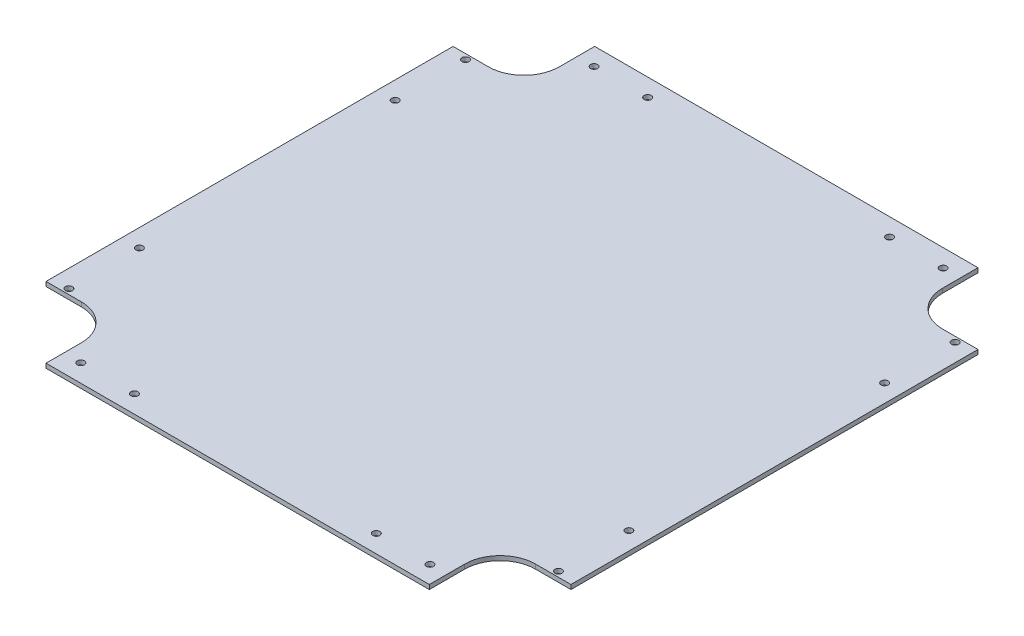
ISO-10303-21;
HEADER;
FILE_DESCRIPTION(('STEP AP214'),'2;1');
FILE_NAME('part.step','',(''),(''),'','','');
FILE_SCHEMA(('AUTOMOTIVE_DESIGN { 1 0 10303 214 1 1 1 1 }'));
ENDSEC;
DATA;
#1=APPLICATION_CONTEXT('core data for automotive mechanical design processes');
#2=APPLICATION_PROTOCOL_DEFINITION('international standard','automotive_design',2000,#1);
#3=PRODUCT_CONTEXT('',#1,'mechanical');
#4=PRODUCT('Part','Part','',(#3));
#5=PRODUCT_RELATED_PRODUCT_CATEGORY('part','',(#4));
#6=PRODUCT_DEFINITION_FORMATION('','',#4);
#7=PRODUCT_DEFINITION_CONTEXT('part definition',#1,'design');
#8=PRODUCT_DEFINITION('design','',#6,#7);
#9=PRODUCT_DEFINITION_SHAPE('','',#8);
#10=(LENGTH_UNIT() NAMED_UNIT(*) SI_UNIT(.MILLI.,.METRE.));
#11=(NAMED_UNIT(*) PLANE_ANGLE_UNIT() SI_UNIT($,.RADIAN.));
#12=(NAMED_UNIT(*) SI_UNIT($,.STERADIAN.) SOLID_ANGLE_UNIT());
#13=UNCERTAINTY_MEASURE_WITH_UNIT(LENGTH_MEASURE(1.E-05),#10,'distance_accuracy_value','');
#14=(GEOMETRIC_REPRESENTATION_CONTEXT(3) GLOBAL_UNCERTAINTY_ASSIGNED_CONTEXT((#13)) GLOBAL_UNIT_ASSIGNED_CONTEXT((#10,
#11,#12)) REPRESENTATION_CONTEXT('',''));
#15=CARTESIAN_POINT('',(0.,0.,0.));
#16=DIRECTION('',(0.,0.,1.));
#17=DIRECTION('',(1.,0.,0.));
#18=AXIS2_PLACEMENT_3D('',#15,#16,#17);
#19=CARTESIAN_POINT('',(0.,-107.700994014148,0.));
#20=DIRECTION('',(0.,1.,0.));
#21=DIRECTION('',(0.,0.,1.));
#22=AXIS2_PLACEMENT_3D('',#19,#20,#21);
#23=PLANE('',#22);
#24=CARTESIAN_POINT('',(-108.626011264322,-107.700994014148,325.262506376595));
#25=DIRECTION('',(0.,1.,0.));
#26=DIRECTION('',(0.,0.,-1.));
#27=AXIS2_PLACEMENT_3D('',#24,#25,#26);
#28=CIRCLE('',#27,3.99999999999999);
#29=CARTESIAN_POINT('',(-108.626011264322,-107.700994014148,321.262506376595));
#30=VERTEX_POINT('',#29);
#31=EDGE_CURVE('E624',#30,#30,#28,.T.);
#32=ORIENTED_EDGE('',*,*,#31,.F.);
#33=EDGE_LOOP('',(#32));
#34=FACE_BOUND('',#33,.T.);
#35=CARTESIAN_POINT('',(-248.563755174876,-107.700994014148,179.77704474851));
#36=DIRECTION('',(0.,1.,0.));
#37=DIRECTION('',(0.,0.,-1.));
#38=AXIS2_PLACEMENT_3D('',#35,#36,#37);
#39=CIRCLE('',#38,3.99999999999999);
#40=CARTESIAN_POINT('',(-248.563755174876,-107.700994014148,175.77704474851));
#41=VERTEX_POINT('',#40);
#42=EDGE_CURVE('E644',#41,#41,#39,.T.);
#43=ORIENTED_EDGE('',*,*,#42,.F.);
#44=EDGE_LOOP('',(#43));
#45=FACE_BOUND('',#44,.T.);
#46=CARTESIAN_POINT('',(164.658028760633,-107.700994014148,325.262506376595));
#47=DIRECTION('',(0.,1.,0.));
#48=DIRECTION('',(0.,0.,1.));
#49=AXIS2_PLACEMENT_3D('',#46,#47,#48);
#50=CIRCLE('',#49,3.99999999999999);
#51=CARTESIAN_POINT('',(164.658028760633,-107.700994014148,329.262506376595));
#52=VERTEX_POINT('',#51);
#53=EDGE_CURVE('E656',#52,#52,#50,.T.);
#54=ORIENTED_EDGE('',*,*,#53,.F.);
#55=EDGE_LOOP('',(#54));
#56=FACE_BOUND('',#55,.T.);
#57=CARTESIAN_POINT('',(304.595772671188,-107.700994014148,259.362686002107));
#58=DIRECTION('',(0.,1.,0.));
#59=DIRECTION('',(0.,0.,1.));
#60=AXIS2_PLACEMENT_3D('',#57,#58,#59);
#61=CIRCLE('',#60,3.99999999999999);
#62=CARTESIAN_POINT('',(304.595772671188,-107.700994014148,263.362686002107));
#63=VERTEX_POINT('',#62);
#64=EDGE_CURVE('E668',#63,#63,#61,.T.);
#65=ORIENTED_EDGE('',*,*,#64,.F.);
#66=EDGE_LOOP('',(#65));
#67=FACE_BOUND('',#66,.T.);
#68=CARTESIAN_POINT('',(225.240436722281,-107.700994014148,-254.737493623406));
#69=DIRECTION('',(0.,1.,0.));
#70=DIRECTION('',(0.,0.,-1.));
#71=AXIS2_PLACEMENT_3D('',#68,#69,#70);
#72=CIRCLE('',#71,3.99999999999999);
#73=CARTESIAN_POINT('',(225.240436722281,-107.700994014148,-258.737493623406));
#74=VERTEX_POINT('',#73);
#75=EDGE_CURVE('E680',#74,#74,#72,.T.);
#76=ORIENTED_EDGE('',*,*,#75,.F.);
#77=EDGE_LOOP('',(#76));
#78=FACE_BOUND('',#77,.T.);
#79=CARTESIAN_POINT('',(304.595772671188,-107.700994014148,-109.252031995321));
#80=DIRECTION('',(0.,1.,0.));
#81=DIRECTION('',(0.,0.,-1.));
#82=AXIS2_PLACEMENT_3D('',#79,#80,#81);
#83=CIRCLE('',#82,3.99999999999999);
#84=CARTESIAN_POINT('',(304.595772671188,-107.700994014148,-113.252031995321));
#85=VERTEX_POINT('',#84);
#86=EDGE_CURVE('E692',#85,#85,#83,.T.);
#87=ORIENTED_EDGE('',*,*,#86,.F.);
#88=EDGE_LOOP('',(#87));
#89=FACE_BOUND('',#88,.T.);
#90=CARTESIAN_POINT('',(-248.563755174876,-107.700994014148,-188.837673248918));
#91=DIRECTION('',(0.,1.,0.));
#92=DIRECTION('',(0.,0.,1.));
#93=AXIS2_PLACEMENT_3D('',#90,#91,#92);
#94=CIRCLE('',#93,3.99999999999999);
#95=CARTESIAN_POINT('',(-248.563755174876,-107.700994014148,-184.837673248918));
#96=VERTEX_POINT('',#95);
#97=EDGE_CURVE('E704',#96,#96,#94,.T.);
#98=ORIENTED_EDGE('',*,*,#97,.F.);
#99=EDGE_LOOP('',(#98));
#100=FACE_BOUND('',#99,.T.);
#101=CARTESIAN_POINT('',(-108.626011264322,-107.700994014148,-254.737493623406));
#102=DIRECTION('',(0.,1.,0.));
#103=DIRECTION('',(0.,0.,1.));
#104=AXIS2_PLACEMENT_3D('',#101,#102,#103);
#105=CIRCLE('',#104,3.99999999999999);
#106=CARTESIAN_POINT('',(-108.626011264322,-107.700994014148,-250.737493623406));
#107=VERTEX_POINT('',#106);
#108=EDGE_CURVE('E198',#107,#107,#105,.T.);
#109=ORIENTED_EDGE('',*,*,#108,.F.);
#110=EDGE_LOOP('',(#109));
#111=FACE_BOUND('',#110,.T.);
#112=DIRECTION('',(0.,0.,1.));
#113=VECTOR('',#112,1.);
#114=CARTESIAN_POINT('',(-188.563755174876,-107.700994014148,-274.737493623405));
#115=LINE('',#114,#113);
#116=CARTESIAN_POINT('',(-188.563755174876,-107.700994014148,-274.737493623405));
#117=VERTEX_POINT('',#116);
#118=CARTESIAN_POINT('',(-188.563755174876,-107.700994014148,-234.737493623405));
#119=VERTEX_POINT('',#118);
#120=EDGE_CURVE('E157',#117,#119,#115,.T.);
#121=ORIENTED_EDGE('',*,*,#120,.T.);
#122=CARTESIAN_POINT('',(-228.563755174876,-107.700994014148,-234.737493623405));
#123=DIRECTION('',(0.,1.,0.));
#124=DIRECTION('',(0.,0.,1.));
#125=AXIS2_PLACEMENT_3D('',#122,#123,#124);
#126=CIRCLE('',#125,40.);
#127=CARTESIAN_POINT('',(-228.563755174876,-107.700994014148,-194.737493623405));
#128=VERTEX_POINT('',#127);
#129=EDGE_CURVE('E153',#119,#128,#126,.F.);
#130=ORIENTED_EDGE('',*,*,#129,.T.);
#131=DIRECTION('',(-1.,0.,0.));
#132=VECTOR('',#131,1.);
#133=CARTESIAN_POINT('',(-268.563755174877,-107.700994014148,-194.737493623405));
#134=LINE('',#133,#132);
#135=CARTESIAN_POINT('',(-268.563755174877,-107.700994014148,-194.737493623405));
#136=VERTEX_POINT('',#135);
#137=EDGE_CURVE('E145',#128,#136,#134,.T.);
#138=ORIENTED_EDGE('',*,*,#137,.T.);
#139=DIRECTION('',(0.,0.,1.));
#140=VECTOR('',#139,1.);
#141=CARTESIAN_POINT('',(-268.563755174877,-107.700994014148,-194.737493623405));
#142=LINE('',#141,#140);
#143=CARTESIAN_POINT('',(-268.563755174876,-107.700994014148,265.262506376595));
#144=VERTEX_POINT('',#143);
#145=EDGE_CURVE('E150',#136,#144,#142,.T.);
#146=ORIENTED_EDGE('',*,*,#145,.T.);
#147=DIRECTION('',(1.,0.,0.));
#148=VECTOR('',#147,1.);
#149=CARTESIAN_POINT('',(-268.563755174876,-107.700994014148,265.262506376595));
#150=LINE('',#149,#148);
#151=CARTESIAN_POINT('',(-228.563755174876,-107.700994014148,265.262506376595));
#152=VERTEX_POINT('',#151);
#153=EDGE_CURVE('E171',#144,#152,#150,.T.);
#154=ORIENTED_EDGE('',*,*,#153,.T.);
#155=CARTESIAN_POINT('',(-228.563755174876,-107.700994014148,305.262506376595));
#156=DIRECTION('',(0.,1.,0.));
#157=DIRECTION('',(0.,0.,1.));
#158=AXIS2_PLACEMENT_3D('',#155,#156,#157);
#159=CIRCLE('',#158,40.);
#160=CARTESIAN_POINT('',(-188.563755174876,-107.700994014148,305.262506376595));
#161=VERTEX_POINT('',#160);
#162=EDGE_CURVE('E11',#152,#161,#159,.F.);
#163=ORIENTED_EDGE('',*,*,#162,.T.);
#164=DIRECTION('',(0.,0.,1.));
#165=VECTOR('',#164,1.);
#166=CARTESIAN_POINT('',(-188.563755174876,-107.700994014148,265.262506376595));
#167=LINE('',#166,#165);
#168=CARTESIAN_POINT('',(-188.563755174876,-107.700994014148,345.262506376595));
#169=VERTEX_POINT('',#168);
#170=EDGE_CURVE('E173',#161,#169,#167,.T.);
#171=ORIENTED_EDGE('',*,*,#170,.T.);
#172=DIRECTION('',(1.,0.,0.));
#173=VECTOR('',#172,1.);
#174=CARTESIAN_POINT('',(-188.563755174876,-107.700994014148,345.262506376595));
#175=LINE('',#174,#173);
#176=CARTESIAN_POINT('',(244.595772671187,-107.700994014148,345.262506376594));
#177=VERTEX_POINT('',#176);
#178=EDGE_CURVE('E178',#169,#177,#175,.T.);
#179=ORIENTED_EDGE('',*,*,#178,.T.);
#180=DIRECTION('',(0.,0.,-1.));
#181=VECTOR('',#180,1.);
#182=CARTESIAN_POINT('',(244.595772671187,-107.700994014148,265.262506376595));
#183=LINE('',#182,#181);
#184=CARTESIAN_POINT('',(244.595772671187,-107.700994014148,305.262506376595));
#185=VERTEX_POINT('',#184);
#186=EDGE_CURVE('E180',#177,#185,#183,.T.);
#187=ORIENTED_EDGE('',*,*,#186,.T.);
#188=CARTESIAN_POINT('',(284.595772671187,-107.700994014148,305.262506376595));
#189=DIRECTION('',(0.,1.,0.));
#190=DIRECTION('',(0.,0.,1.));
#191=AXIS2_PLACEMENT_3D('',#188,#189,#190);
#192=CIRCLE('',#191,40.);
#193=CARTESIAN_POINT('',(284.595772671187,-107.700994014148,265.262506376595));
#194=VERTEX_POINT('',#193);
#195=EDGE_CURVE('E266',#185,#194,#192,.F.);
#196=ORIENTED_EDGE('',*,*,#195,.T.);
#197=DIRECTION('',(1.,0.,0.));
#198=VECTOR('',#197,1.);
#199=CARTESIAN_POINT('',(244.595772671187,-107.700994014148,265.262506376595));
#200=LINE('',#199,#198);
#201=CARTESIAN_POINT('',(324.595772671188,-107.700994014148,265.262506376595));
#202=VERTEX_POINT('',#201);
#203=EDGE_CURVE('E183',#194,#202,#200,.T.);
#204=ORIENTED_EDGE('',*,*,#203,.T.);
#205=DIRECTION('',(0.,0.,-1.));
#206=VECTOR('',#205,1.);
#207=CARTESIAN_POINT('',(324.595772671188,-107.700994014148,-194.737493623405));
#208=LINE('',#207,#206);
#209=CARTESIAN_POINT('',(324.595772671188,-107.700994014148,-194.737493623405));
#210=VERTEX_POINT('',#209);
#211=EDGE_CURVE('E185',#202,#210,#208,.T.);
#212=ORIENTED_EDGE('',*,*,#211,.T.);
#213=DIRECTION('',(-1.,0.,0.));
#214=VECTOR('',#213,1.);
#215=CARTESIAN_POINT('',(244.595772671187,-107.700994014148,-194.737493623405));
#216=LINE('',#215,#214);
#217=CARTESIAN_POINT('',(284.595772671187,-107.700994014148,-194.737493623405));
#218=VERTEX_POINT('',#217);
#219=EDGE_CURVE('E187',#210,#218,#216,.T.);
#220=ORIENTED_EDGE('',*,*,#219,.T.);
#221=CARTESIAN_POINT('',(284.595772671187,-107.700994014148,-234.737493623406));
#222=DIRECTION('',(0.,1.,0.));
#223=DIRECTION('',(0.,0.,1.));
#224=AXIS2_PLACEMENT_3D('',#221,#222,#223);
#225=CIRCLE('',#224,40.);
#226=CARTESIAN_POINT('',(244.595772671187,-107.700994014148,-234.737493623406));
#227=VERTEX_POINT('',#226);
#228=EDGE_CURVE('E262',#218,#227,#225,.F.);
#229=ORIENTED_EDGE('',*,*,#228,.T.);
#230=DIRECTION('',(0.,0.,-1.));
#231=VECTOR('',#230,1.);
#232=CARTESIAN_POINT('',(244.595772671187,-107.700994014148,-274.737493623405));
#233=LINE('',#232,#231);
#234=CARTESIAN_POINT('',(244.595772671187,-107.700994014148,-274.737493623405));
#235=VERTEX_POINT('',#234);
#236=EDGE_CURVE('E190',#227,#235,#233,.T.);
#237=ORIENTED_EDGE('',*,*,#236,.T.);
#238=DIRECTION('',(-1.,0.,0.));
#239=VECTOR('',#238,1.);
#240=CARTESIAN_POINT('',(-188.563755174876,-107.700994014148,-274.737493623405));
#241=LINE('',#240,#239);
#242=EDGE_CURVE('E192',#235,#117,#241,.T.);
#243=ORIENTED_EDGE('',*,*,#242,.T.);
#244=EDGE_LOOP('',(#121,#130,#138,#146,#154,#163,#171,#179,#187,#196,#204,#212,#220,#229,#237,#243));
#245=FACE_BOUND('',#244,.T.);
#246=CARTESIAN_POINT('',(-169.208419225969,-107.700994014148,-254.737493623406));
#247=DIRECTION('',(0.,1.,0.));
#248=DIRECTION('',(0.,0.,1.));
#249=AXIS2_PLACEMENT_3D('',#246,#247,#248);
#250=CIRCLE('',#249,3.99999999999999);
#251=CARTESIAN_POINT('',(-169.208419225969,-107.700994014148,-250.737493623406));
#252=VERTEX_POINT('',#251);
#253=EDGE_CURVE('E710',#252,#252,#250,.T.);
#254=ORIENTED_EDGE('',*,*,#253,.F.);
#255=EDGE_LOOP('',(#254));
#256=FACE_BOUND('',#255,.T.);
#257=CARTESIAN_POINT('',(-248.563755174876,-107.700994014148,-109.252031995321));
#258=DIRECTION('',(0.,1.,0.));
#259=DIRECTION('',(0.,0.,1.));
#260=AXIS2_PLACEMENT_3D('',#257,#258,#259);
#261=CIRCLE('',#260,3.99999999999999);
#262=CARTESIAN_POINT('',(-248.563755174876,-107.700994014148,-105.252031995321));
#263=VERTEX_POINT('',#262);
#264=EDGE_CURVE('E698',#263,#263,#261,.T.);
#265=ORIENTED_EDGE('',*,*,#264,.F.);
#266=EDGE_LOOP('',(#265));
#267=FACE_BOUND('',#266,.T.);
#268=CARTESIAN_POINT('',(164.658028760633,-107.700994014148,-254.737493623406));
#269=DIRECTION('',(0.,1.,0.));
#270=DIRECTION('',(0.,0.,-1.));
#271=AXIS2_PLACEMENT_3D('',#268,#269,#270);
#272=CIRCLE('',#271,3.99999999999999);
#273=CARTESIAN_POINT('',(164.658028760633,-107.700994014148,-258.737493623406));
#274=VERTEX_POINT('',#273);
#275=EDGE_CURVE('E686',#274,#274,#272,.T.);
#276=ORIENTED_EDGE('',*,*,#275,.F.);
#277=EDGE_LOOP('',(#276));
#278=FACE_BOUND('',#277,.T.);
#279=CARTESIAN_POINT('',(304.595772671188,-107.700994014148,-188.837673248918));
#280=DIRECTION('',(0.,1.,0.));
#281=DIRECTION('',(0.,0.,-1.));
#282=AXIS2_PLACEMENT_3D('',#279,#280,#281);
#283=CIRCLE('',#282,3.99999999999999);
#284=CARTESIAN_POINT('',(304.595772671188,-107.700994014148,-192.837673248918));
#285=VERTEX_POINT('',#284);
#286=EDGE_CURVE('E674',#285,#285,#283,.T.);
#287=ORIENTED_EDGE('',*,*,#286,.F.);
#288=EDGE_LOOP('',(#287));
#289=FACE_BOUND('',#288,.T.);
#290=CARTESIAN_POINT('',(225.240436722281,-107.700994014148,325.262506376595));
#291=DIRECTION('',(0.,1.,0.));
#292=DIRECTION('',(0.,0.,1.));
#293=AXIS2_PLACEMENT_3D('',#290,#291,#292);
#294=CIRCLE('',#293,3.99999999999999);
#295=CARTESIAN_POINT('',(225.240436722281,-107.700994014148,329.262506376595));
#296=VERTEX_POINT('',#295);
#297=EDGE_CURVE('E662',#296,#296,#294,.T.);
#298=ORIENTED_EDGE('',*,*,#297,.F.);
#299=EDGE_LOOP('',(#298));
#300=FACE_BOUND('',#299,.T.);
#301=CARTESIAN_POINT('',(304.595772671188,-107.700994014148,179.77704474851));
#302=DIRECTION('',(0.,1.,0.));
#303=DIRECTION('',(0.,0.,1.));
#304=AXIS2_PLACEMENT_3D('',#301,#302,#303);
#305=CIRCLE('',#304,3.99999999999999);
#306=CARTESIAN_POINT('',(304.595772671188,-107.700994014148,183.77704474851));
#307=VERTEX_POINT('',#306);
#308=EDGE_CURVE('E650',#307,#307,#305,.T.);
#309=ORIENTED_EDGE('',*,*,#308,.F.);
#310=EDGE_LOOP('',(#309));
#311=FACE_BOUND('',#310,.T.);
#312=CARTESIAN_POINT('',(-248.563755174876,-107.700994014148,259.362686002108));
#313=DIRECTION('',(0.,1.,0.));
#314=DIRECTION('',(0.,0.,-1.));
#315=AXIS2_PLACEMENT_3D('',#312,#313,#314);
#316=CIRCLE('',#315,3.99999999999999);
#317=CARTESIAN_POINT('',(-248.563755174876,-107.700994014148,255.362686002108));
#318=VERTEX_POINT('',#317);
#319=EDGE_CURVE('E638',#318,#318,#316,.T.);
#320=ORIENTED_EDGE('',*,*,#319,.F.);
#321=EDGE_LOOP('',(#320));
#322=FACE_BOUND('',#321,.T.);
#323=CARTESIAN_POINT('',(-169.208419225969,-107.700994014148,325.262506376595));
#324=DIRECTION('',(0.,1.,0.));
#325=DIRECTION('',(0.,0.,-1.));
#326=AXIS2_PLACEMENT_3D('',#323,#324,#325);
#327=CIRCLE('',#326,3.99999999999999);
#328=CARTESIAN_POINT('',(-169.208419225969,-107.700994014148,321.262506376595));
#329=VERTEX_POINT('',#328);
#330=EDGE_CURVE('E629',#329,#329,#327,.T.);
#331=ORIENTED_EDGE('',*,*,#330,.F.);
#332=EDGE_LOOP('',(#331));
#333=FACE_BOUND('',#332,.T.);
#334=ADVANCED_FACE('F33',(#34,#45,#56,#67,#78,#89,#100,#111,#245,#256,#267,#278,#289,#300,#311,
#322,#333),#23,.T.);
#335=CARTESIAN_POINT('',(0.,-112.700994014148,0.));
#336=DIRECTION('',(0.,1.,0.));
#337=DIRECTION('',(0.,0.,1.));
#338=AXIS2_PLACEMENT_3D('',#335,#336,#337);
#339=PLANE('',#338);
#340=DIRECTION('',(0.,0.,1.));
#341=VECTOR('',#340,1.);
#342=CARTESIAN_POINT('',(-188.563755174876,-112.700994014148,-274.737493623405));
#343=LINE('',#342,#341);
#344=CARTESIAN_POINT('',(-188.563755174876,-112.700994014148,-274.737493623405));
#345=VERTEX_POINT('',#344);
#346=CARTESIAN_POINT('',(-188.563755174876,-112.700994014148,-234.737493623405));
#347=VERTEX_POINT('',#346);
#348=EDGE_CURVE('E195',#345,#347,#343,.T.);
#349=ORIENTED_EDGE('',*,*,#348,.F.);
#350=DIRECTION('',(-1.,0.,0.));
#351=VECTOR('',#350,1.);
#352=CARTESIAN_POINT('',(-188.563755174876,-112.700994014148,-274.737493623405));
#353=LINE('',#352,#351);
#354=CARTESIAN_POINT('',(244.595772671187,-112.700994014148,-274.737493623405));
#355=VERTEX_POINT('',#354);
#356=EDGE_CURVE('E220',#355,#345,#353,.T.);
#357=ORIENTED_EDGE('',*,*,#356,.F.);
#358=DIRECTION('',(0.,0.,-1.));
#359=VECTOR('',#358,1.);
#360=CARTESIAN_POINT('',(244.595772671187,-112.700994014148,-274.737493623405));
#361=LINE('',#360,#359);
#362=CARTESIAN_POINT('',(244.595772671187,-112.700994014148,-234.737493623406));
#363=VERTEX_POINT('',#362);
#364=EDGE_CURVE('E218',#363,#355,#361,.T.);
#365=ORIENTED_EDGE('',*,*,#364,.F.);
#366=CARTESIAN_POINT('',(284.595772671187,-112.700994014148,-234.737493623406));
#367=DIRECTION('',(0.,1.,0.));
#368=DIRECTION('',(0.,0.,1.));
#369=AXIS2_PLACEMENT_3D('',#366,#367,#368);
#370=CIRCLE('',#369,40.);
#371=CARTESIAN_POINT('',(284.595772671187,-112.700994014148,-194.737493623405));
#372=VERTEX_POINT('',#371);
#373=EDGE_CURVE('E260',#363,#372,#370,.T.);
#374=ORIENTED_EDGE('',*,*,#373,.T.);
#375=DIRECTION('',(-1.,0.,0.));
#376=VECTOR('',#375,1.);
#377=CARTESIAN_POINT('',(244.595772671187,-112.700994014148,-194.737493623405));
#378=LINE('',#377,#376);
#379=CARTESIAN_POINT('',(324.595772671188,-112.700994014148,-194.737493623405));
#380=VERTEX_POINT('',#379);
#381=EDGE_CURVE('E215',#380,#372,#378,.T.);
#382=ORIENTED_EDGE('',*,*,#381,.F.);
#383=DIRECTION('',(0.,0.,-1.));
#384=VECTOR('',#383,1.);
#385=CARTESIAN_POINT('',(324.595772671188,-112.700994014148,-194.737493623405));
#386=LINE('',#385,#384);
#387=CARTESIAN_POINT('',(324.595772671188,-112.700994014148,265.262506376595));
#388=VERTEX_POINT('',#387);
#389=EDGE_CURVE('E213',#388,#380,#386,.T.);
#390=ORIENTED_EDGE('',*,*,#389,.F.);
#391=DIRECTION('',(1.,0.,0.));
#392=VECTOR('',#391,1.);
#393=CARTESIAN_POINT('',(244.595772671187,-112.700994014148,265.262506376595));
#394=LINE('',#393,#392);
#395=CARTESIAN_POINT('',(284.595772671187,-112.700994014148,265.262506376595));
#396=VERTEX_POINT('',#395);
#397=EDGE_CURVE('E211',#396,#388,#394,.T.);
#398=ORIENTED_EDGE('',*,*,#397,.F.);
#399=CARTESIAN_POINT('',(284.595772671187,-112.700994014148,305.262506376595));
#400=DIRECTION('',(0.,1.,0.));
#401=DIRECTION('',(0.,0.,1.));
#402=AXIS2_PLACEMENT_3D('',#399,#400,#401);
#403=CIRCLE('',#402,40.);
#404=CARTESIAN_POINT('',(244.595772671187,-112.700994014148,305.262506376595));
#405=VERTEX_POINT('',#404);
#406=EDGE_CURVE('E264',#396,#405,#403,.T.);
#407=ORIENTED_EDGE('',*,*,#406,.T.);
#408=DIRECTION('',(0.,0.,-1.));
#409=VECTOR('',#408,1.);
#410=CARTESIAN_POINT('',(244.595772671187,-112.700994014148,265.262506376595));
#411=LINE('',#410,#409);
#412=CARTESIAN_POINT('',(244.595772671187,-112.700994014148,345.262506376594));
#413=VERTEX_POINT('',#412);
#414=EDGE_CURVE('E208',#413,#405,#411,.T.);
#415=ORIENTED_EDGE('',*,*,#414,.F.);
#416=DIRECTION('',(1.,0.,0.));
#417=VECTOR('',#416,1.);
#418=CARTESIAN_POINT('',(-188.563755174876,-112.700994014148,345.262506376595));
#419=LINE('',#418,#417);
#420=CARTESIAN_POINT('',(-188.563755174876,-112.700994014148,345.262506376595));
#421=VERTEX_POINT('',#420);
#422=EDGE_CURVE('E206',#421,#413,#419,.T.);
#423=ORIENTED_EDGE('',*,*,#422,.F.);
#424=DIRECTION('',(0.,0.,1.));
#425=VECTOR('',#424,1.);
#426=CARTESIAN_POINT('',(-188.563755174876,-112.700994014148,265.262506376595));
#427=LINE('',#426,#425);
#428=CARTESIAN_POINT('',(-188.563755174876,-112.700994014148,305.262506376595));
#429=VERTEX_POINT('',#428);
#430=EDGE_CURVE('E204',#429,#421,#427,.T.);
#431=ORIENTED_EDGE('',*,*,#430,.F.);
#432=CARTESIAN_POINT('',(-228.563755174876,-112.700994014148,305.262506376595));
#433=DIRECTION('',(0.,1.,0.));
#434=DIRECTION('',(0.,0.,1.));
#435=AXIS2_PLACEMENT_3D('',#432,#433,#434);
#436=CIRCLE('',#435,40.);
#437=CARTESIAN_POINT('',(-228.563755174876,-112.700994014148,265.262506376595));
#438=VERTEX_POINT('',#437);
#439=EDGE_CURVE('E41',#429,#438,#436,.T.);
#440=ORIENTED_EDGE('',*,*,#439,.T.);
#441=DIRECTION('',(1.,0.,0.));
#442=VECTOR('',#441,1.);
#443=CARTESIAN_POINT('',(-268.563755174876,-112.700994014148,265.262506376595));
#444=LINE('',#443,#442);
#445=CARTESIAN_POINT('',(-268.563755174876,-112.700994014148,265.262506376595));
#446=VERTEX_POINT('',#445);
#447=EDGE_CURVE('E202',#446,#438,#444,.T.);
#448=ORIENTED_EDGE('',*,*,#447,.F.);
#449=DIRECTION('',(0.,0.,1.));
#450=VECTOR('',#449,1.);
#451=CARTESIAN_POINT('',(-268.563755174877,-112.700994014148,-194.737493623405));
#452=LINE('',#451,#450);
#453=CARTESIAN_POINT('',(-268.563755174877,-112.700994014148,-194.737493623405));
#454=VERTEX_POINT('',#453);
#455=EDGE_CURVE('E200',#454,#446,#452,.T.);
#456=ORIENTED_EDGE('',*,*,#455,.F.);
#457=DIRECTION('',(-1.,0.,0.));
#458=VECTOR('',#457,1.);
#459=CARTESIAN_POINT('',(-268.563755174877,-112.700994014148,-194.737493623405));
#460=LINE('',#459,#458);
#461=CARTESIAN_POINT('',(-228.563755174876,-112.700994014148,-194.737493623405));
#462=VERTEX_POINT('',#461);
#463=EDGE_CURVE('E163',#462,#454,#460,.T.);
#464=ORIENTED_EDGE('',*,*,#463,.F.);
#465=CARTESIAN_POINT('',(-228.563755174876,-112.700994014148,-234.737493623405));
#466=DIRECTION('',(0.,1.,0.));
#467=DIRECTION('',(0.,0.,1.));
#468=AXIS2_PLACEMENT_3D('',#465,#466,#467);
#469=CIRCLE('',#468,40.);
#470=EDGE_CURVE('E257',#462,#347,#469,.T.);
#471=ORIENTED_EDGE('',*,*,#470,.T.);
#472=EDGE_LOOP('',(#349,#357,#365,#374,#382,#390,#398,#407,#415,#423,#431,#440,#448,#456,#464,#471));
#473=FACE_BOUND('',#472,.T.);
#474=CARTESIAN_POINT('',(-108.626011264322,-112.700994014148,-254.737493623406));
#475=DIRECTION('',(0.,1.,0.));
#476=DIRECTION('',(0.,0.,1.));
#477=AXIS2_PLACEMENT_3D('',#474,#475,#476);
#478=CIRCLE('',#477,3.99999999999999);
#479=CARTESIAN_POINT('',(-108.626011264322,-112.700994014148,-250.737493623406));
#480=VERTEX_POINT('',#479);
#481=EDGE_CURVE('E713',#480,#480,#478,.T.);
#482=ORIENTED_EDGE('',*,*,#481,.T.);
#483=EDGE_LOOP('',(#482));
#484=FACE_BOUND('',#483,.T.);
#485=CARTESIAN_POINT('',(-169.208419225969,-112.700994014148,-254.737493623406));
#486=DIRECTION('',(0.,1.,0.));
#487=DIRECTION('',(0.,0.,1.));
#488=AXIS2_PLACEMENT_3D('',#485,#486,#487);
#489=CIRCLE('',#488,3.99999999999999);
#490=CARTESIAN_POINT('',(-169.208419225969,-112.700994014148,-250.737493623406));
#491=VERTEX_POINT('',#490);
#492=EDGE_CURVE('E707',#491,#491,#489,.T.);
#493=ORIENTED_EDGE('',*,*,#492,.T.);
#494=EDGE_LOOP('',(#493));
#495=FACE_BOUND('',#494,.T.);
#496=CARTESIAN_POINT('',(-248.563755174876,-112.700994014148,-188.837673248918));
#497=DIRECTION('',(0.,1.,0.));
#498=DIRECTION('',(0.,0.,1.));
#499=AXIS2_PLACEMENT_3D('',#496,#497,#498);
#500=CIRCLE('',#499,3.99999999999999);
#501=CARTESIAN_POINT('',(-248.563755174876,-112.700994014148,-184.837673248918));
#502=VERTEX_POINT('',#501);
#503=EDGE_CURVE('E701',#502,#502,#500,.T.);
#504=ORIENTED_EDGE('',*,*,#503,.T.);
#505=EDGE_LOOP('',(#504));
#506=FACE_BOUND('',#505,.T.);
#507=CARTESIAN_POINT('',(-248.563755174876,-112.700994014148,-109.252031995321));
#508=DIRECTION('',(0.,1.,0.));
#509=DIRECTION('',(0.,0.,1.));
#510=AXIS2_PLACEMENT_3D('',#507,#508,#509);
#511=CIRCLE('',#510,3.99999999999999);
#512=CARTESIAN_POINT('',(-248.563755174876,-112.700994014148,-105.252031995321));
#513=VERTEX_POINT('',#512);
#514=EDGE_CURVE('E695',#513,#513,#511,.T.);
#515=ORIENTED_EDGE('',*,*,#514,.T.);
#516=EDGE_LOOP('',(#515));
#517=FACE_BOUND('',#516,.T.);
#518=CARTESIAN_POINT('',(304.595772671188,-112.700994014148,-109.252031995321));
#519=DIRECTION('',(0.,1.,0.));
#520=DIRECTION('',(0.,0.,-1.));
#521=AXIS2_PLACEMENT_3D('',#518,#519,#520);
#522=CIRCLE('',#521,3.99999999999999);
#523=CARTESIAN_POINT('',(304.595772671188,-112.700994014148,-113.252031995321));
#524=VERTEX_POINT('',#523);
#525=EDGE_CURVE('E689',#524,#524,#522,.T.);
#526=ORIENTED_EDGE('',*,*,#525,.T.);
#527=EDGE_LOOP('',(#526));
#528=FACE_BOUND('',#527,.T.);
#529=CARTESIAN_POINT('',(164.658028760633,-112.700994014148,-254.737493623406));
#530=DIRECTION('',(0.,1.,0.));
#531=DIRECTION('',(0.,0.,-1.));
#532=AXIS2_PLACEMENT_3D('',#529,#530,#531);
#533=CIRCLE('',#532,3.99999999999999);
#534=CARTESIAN_POINT('',(164.658028760633,-112.700994014148,-258.737493623406));
#535=VERTEX_POINT('',#534);
#536=EDGE_CURVE('E683',#535,#535,#533,.T.);
#537=ORIENTED_EDGE('',*,*,#536,.T.);
#538=EDGE_LOOP('',(#537));
#539=FACE_BOUND('',#538,.T.);
#540=CARTESIAN_POINT('',(225.240436722281,-112.700994014148,-254.737493623406));
#541=DIRECTION('',(0.,1.,0.));
#542=DIRECTION('',(0.,0.,-1.));
#543=AXIS2_PLACEMENT_3D('',#540,#541,#542);
#544=CIRCLE('',#543,3.99999999999999);
#545=CARTESIAN_POINT('',(225.240436722281,-112.700994014148,-258.737493623406));
#546=VERTEX_POINT('',#545);
#547=EDGE_CURVE('E677',#546,#546,#544,.T.);
#548=ORIENTED_EDGE('',*,*,#547,.T.);
#549=EDGE_LOOP('',(#548));
#550=FACE_BOUND('',#549,.T.);
#551=CARTESIAN_POINT('',(304.595772671188,-112.700994014148,-188.837673248918));
#552=DIRECTION('',(0.,1.,0.));
#553=DIRECTION('',(0.,0.,-1.));
#554=AXIS2_PLACEMENT_3D('',#551,#552,#553);
#555=CIRCLE('',#554,3.99999999999999);
#556=CARTESIAN_POINT('',(304.595772671188,-112.700994014148,-192.837673248918));
#557=VERTEX_POINT('',#556);
#558=EDGE_CURVE('E671',#557,#557,#555,.T.);
#559=ORIENTED_EDGE('',*,*,#558,.T.);
#560=EDGE_LOOP('',(#559));
#561=FACE_BOUND('',#560,.T.);
#562=CARTESIAN_POINT('',(304.595772671188,-112.700994014148,259.362686002107));
#563=DIRECTION('',(0.,1.,0.));
#564=DIRECTION('',(0.,0.,1.));
#565=AXIS2_PLACEMENT_3D('',#562,#563,#564);
#566=CIRCLE('',#565,3.99999999999999);
#567=CARTESIAN_POINT('',(304.595772671188,-112.700994014148,263.362686002107));
#568=VERTEX_POINT('',#567);
#569=EDGE_CURVE('E665',#568,#568,#566,.T.);
#570=ORIENTED_EDGE('',*,*,#569,.T.);
#571=EDGE_LOOP('',(#570));
#572=FACE_BOUND('',#571,.T.);
#573=CARTESIAN_POINT('',(225.240436722281,-112.700994014148,325.262506376595));
#574=DIRECTION('',(0.,1.,0.));
#575=DIRECTION('',(0.,0.,1.));
#576=AXIS2_PLACEMENT_3D('',#573,#574,#575);
#577=CIRCLE('',#576,3.99999999999999);
#578=CARTESIAN_POINT('',(225.240436722281,-112.700994014148,329.262506376595));
#579=VERTEX_POINT('',#578);
#580=EDGE_CURVE('E659',#579,#579,#577,.T.);
#581=ORIENTED_EDGE('',*,*,#580,.T.);
#582=EDGE_LOOP('',(#581));
#583=FACE_BOUND('',#582,.T.);
#584=CARTESIAN_POINT('',(164.658028760633,-112.700994014148,325.262506376595));
#585=DIRECTION('',(0.,1.,0.));
#586=DIRECTION('',(0.,0.,1.));
#587=AXIS2_PLACEMENT_3D('',#584,#585,#586);
#588=CIRCLE('',#587,3.99999999999999);
#589=CARTESIAN_POINT('',(164.658028760633,-112.700994014148,329.262506376595));
#590=VERTEX_POINT('',#589);
#591=EDGE_CURVE('E653',#590,#590,#588,.T.);
#592=ORIENTED_EDGE('',*,*,#591,.T.);
#593=EDGE_LOOP('',(#592));
#594=FACE_BOUND('',#593,.T.);
#595=CARTESIAN_POINT('',(304.595772671188,-112.700994014148,179.77704474851));
#596=DIRECTION('',(0.,1.,0.));
#597=DIRECTION('',(0.,0.,1.));
#598=AXIS2_PLACEMENT_3D('',#595,#596,#597);
#599=CIRCLE('',#598,3.99999999999999);
#600=CARTESIAN_POINT('',(304.595772671188,-112.700994014148,183.77704474851));
#601=VERTEX_POINT('',#600);
#602=EDGE_CURVE('E647',#601,#601,#599,.T.);
#603=ORIENTED_EDGE('',*,*,#602,.T.);
#604=EDGE_LOOP('',(#603));
#605=FACE_BOUND('',#604,.T.);
#606=CARTESIAN_POINT('',(-248.563755174876,-112.700994014148,179.77704474851));
#607=DIRECTION('',(0.,1.,0.));
#608=DIRECTION('',(0.,0.,-1.));
#609=AXIS2_PLACEMENT_3D('',#606,#607,#608);
#610=CIRCLE('',#609,3.99999999999999);
#611=CARTESIAN_POINT('',(-248.563755174876,-112.700994014148,175.77704474851));
#612=VERTEX_POINT('',#611);
#613=EDGE_CURVE('E641',#612,#612,#610,.T.);
#614=ORIENTED_EDGE('',*,*,#613,.T.);
#615=EDGE_LOOP('',(#614));
#616=FACE_BOUND('',#615,.T.);
#617=CARTESIAN_POINT('',(-248.563755174876,-112.700994014148,259.362686002108));
#618=DIRECTION('',(0.,1.,0.));
#619=DIRECTION('',(0.,0.,-1.));
#620=AXIS2_PLACEMENT_3D('',#617,#618,#619);
#621=CIRCLE('',#620,3.99999999999999);
#622=CARTESIAN_POINT('',(-248.563755174876,-112.700994014148,255.362686002108));
#623=VERTEX_POINT('',#622);
#624=EDGE_CURVE('E631',#623,#623,#621,.T.);
#625=ORIENTED_EDGE('',*,*,#624,.T.);
#626=EDGE_LOOP('',(#625));
#627=FACE_BOUND('',#626,.T.);
#628=CARTESIAN_POINT('',(-108.626011264322,-112.700994014148,325.262506376595));
#629=DIRECTION('',(0.,1.,0.));
#630=DIRECTION('',(0.,0.,-1.));
#631=AXIS2_PLACEMENT_3D('',#628,#629,#630);
#632=CIRCLE('',#631,3.99999999999999);
#633=CARTESIAN_POINT('',(-108.626011264322,-112.700994014148,321.262506376595));
#634=VERTEX_POINT('',#633);
#635=EDGE_CURVE('E627',#634,#634,#632,.T.);
#636=ORIENTED_EDGE('',*,*,#635,.T.);
#637=EDGE_LOOP('',(#636));
#638=FACE_BOUND('',#637,.T.);
#639=CARTESIAN_POINT('',(-169.208419225969,-112.700994014148,325.262506376595));
#640=DIRECTION('',(0.,1.,0.));
#641=DIRECTION('',(0.,0.,-1.));
#642=AXIS2_PLACEMENT_3D('',#639,#640,#641);
#643=CIRCLE('',#642,3.99999999999999);
#644=CARTESIAN_POINT('',(-169.208419225969,-112.700994014148,321.262506376595));
#645=VERTEX_POINT('',#644);
#646=EDGE_CURVE('E634',#645,#645,#643,.T.);
#647=ORIENTED_EDGE('',*,*,#646,.T.);
#648=EDGE_LOOP('',(#647));
#649=FACE_BOUND('',#648,.T.);
#650=ADVANCED_FACE('F281',(#473,#484,#495,#506,#517,#528,#539,#550,#561,#572,#583,#594,#605,
#616,#627,#638,#649),#339,.F.);
#651=CARTESIAN_POINT('',(-188.563755174876,-107.700994014148,-274.737493623405));
#652=DIRECTION('',(1.,0.,0.));
#653=DIRECTION('',(0.,0.,-1.));
#654=AXIS2_PLACEMENT_3D('',#651,#652,#653);
#655=PLANE('',#654);
#656=ORIENTED_EDGE('',*,*,#348,.T.);
#657=DIRECTION('',(0.,-1.,0.));
#658=VECTOR('',#657,1.);
#659=CARTESIAN_POINT('',(-188.563755174876,-107.700994014148,-234.737493623405));
#660=LINE('',#659,#658);
#661=EDGE_CURVE('E241',#347,#119,#660,.F.);
#662=ORIENTED_EDGE('',*,*,#661,.T.);
#663=ORIENTED_EDGE('',*,*,#120,.F.);
#664=DIRECTION('',(0.,-1.,0.));
#665=VECTOR('',#664,1.);
#666=CARTESIAN_POINT('',(-188.563755174876,-107.700994014148,-274.737493623405));
#667=LINE('',#666,#665);
#668=EDGE_CURVE('E194',#117,#345,#667,.T.);
#669=ORIENTED_EDGE('',*,*,#668,.T.);
#670=EDGE_LOOP('',(#656,#662,#663,#669));
#671=FACE_BOUND('',#670,.T.);
#672=ADVANCED_FACE('F303',(#671),#655,.F.);
#673=CARTESIAN_POINT('',(-268.563755174877,-107.700994014148,-194.737493623405));
#674=DIRECTION('',(0.,0.,1.));
#675=DIRECTION('',(0.,-1.,0.));
#676=AXIS2_PLACEMENT_3D('',#673,#674,#675);
#677=PLANE('',#676);
#678=ORIENTED_EDGE('',*,*,#137,.F.);
#679=DIRECTION('',(0.,-1.,0.));
#680=VECTOR('',#679,1.);
#681=CARTESIAN_POINT('',(-228.563755174876,-112.700994014148,-194.737493623405));
#682=LINE('',#681,#680);
#683=EDGE_CURVE('E166',#128,#462,#682,.T.);
#684=ORIENTED_EDGE('',*,*,#683,.T.);
#685=ORIENTED_EDGE('',*,*,#463,.T.);
#686=DIRECTION('',(0.,-1.,0.));
#687=VECTOR('',#686,1.);
#688=CARTESIAN_POINT('',(-268.563755174877,-107.700994014148,-194.737493623405));
#689=LINE('',#688,#687);
#690=EDGE_CURVE('E160',#136,#454,#689,.T.);
#691=ORIENTED_EDGE('',*,*,#690,.F.);
#692=EDGE_LOOP('',(#678,#684,#685,#691));
#693=FACE_BOUND('',#692,.T.);
#694=ADVANCED_FACE('F161',(#693),#677,.F.);
#695=CARTESIAN_POINT('',(-268.563755174877,-107.700994014148,-194.737493623405));
#696=DIRECTION('',(1.,0.,0.));
#697=DIRECTION('',(0.,0.,-1.));
#698=AXIS2_PLACEMENT_3D('',#695,#696,#697);
#699=PLANE('',#698);
#700=ORIENTED_EDGE('',*,*,#455,.T.);
#701=DIRECTION('',(0.,-1.,0.));
#702=VECTOR('',#701,1.);
#703=CARTESIAN_POINT('',(-268.563755174876,-107.700994014148,265.262506376595));
#704=LINE('',#703,#702);
#705=EDGE_CURVE('E167',#144,#446,#704,.T.);
#706=ORIENTED_EDGE('',*,*,#705,.F.);
#707=ORIENTED_EDGE('',*,*,#145,.F.);
#708=ORIENTED_EDGE('',*,*,#690,.T.);
#709=EDGE_LOOP('',(#700,#706,#707,#708));
#710=FACE_BOUND('',#709,.T.);
#711=ADVANCED_FACE('F169',(#710),#699,.F.);
#712=CARTESIAN_POINT('',(-268.563755174876,-107.700994014148,265.262506376595));
#713=DIRECTION('',(0.,0.,-1.));
#714=DIRECTION('',(-1.,0.,0.));
#715=AXIS2_PLACEMENT_3D('',#712,#713,#714);
#716=PLANE('',#715);
#717=ORIENTED_EDGE('',*,*,#447,.T.);
#718=DIRECTION('',(0.,-1.,0.));
#719=VECTOR('',#718,1.);
#720=CARTESIAN_POINT('',(-228.563755174876,-107.700994014148,265.262506376595));
#721=LINE('',#720,#719);
#722=EDGE_CURVE('E48',#438,#152,#721,.F.);
#723=ORIENTED_EDGE('',*,*,#722,.T.);
#724=ORIENTED_EDGE('',*,*,#153,.F.);
#725=ORIENTED_EDGE('',*,*,#705,.T.);
#726=EDGE_LOOP('',(#717,#723,#724,#725));
#727=FACE_BOUND('',#726,.T.);
#728=ADVANCED_FACE('F298',(#727),#716,.F.);
#729=CARTESIAN_POINT('',(-188.563755174876,-107.700994014148,265.262506376595));
#730=DIRECTION('',(1.,0.,0.));
#731=DIRECTION('',(0.,0.,-1.));
#732=AXIS2_PLACEMENT_3D('',#729,#730,#731);
#733=PLANE('',#732);
#734=ORIENTED_EDGE('',*,*,#170,.F.);
#735=DIRECTION('',(0.,-1.,0.));
#736=VECTOR('',#735,1.);
#737=CARTESIAN_POINT('',(-188.563755174876,-112.700994014148,305.262506376595));
#738=LINE('',#737,#736);
#739=EDGE_CURVE('E253',#161,#429,#738,.T.);
#740=ORIENTED_EDGE('',*,*,#739,.T.);
#741=ORIENTED_EDGE('',*,*,#430,.T.);
#742=DIRECTION('',(0.,-1.,0.));
#743=VECTOR('',#742,1.);
#744=CARTESIAN_POINT('',(-188.563755174876,-107.700994014148,345.262506376595));
#745=LINE('',#744,#743);
#746=EDGE_CURVE('E236',#169,#421,#745,.T.);
#747=ORIENTED_EDGE('',*,*,#746,.F.);
#748=EDGE_LOOP('',(#734,#740,#741,#747));
#749=FACE_BOUND('',#748,.T.);
#750=ADVANCED_FACE('F294',(#749),#733,.F.);
#751=CARTESIAN_POINT('',(-188.563755174876,-107.700994014148,345.262506376595));
#752=DIRECTION('',(0.,0.,-1.));
#753=DIRECTION('',(-1.,0.,0.));
#754=AXIS2_PLACEMENT_3D('',#751,#752,#753);
#755=PLANE('',#754);
#756=ORIENTED_EDGE('',*,*,#422,.T.);
#757=DIRECTION('',(0.,-1.,0.));
#758=VECTOR('',#757,1.);
#759=CARTESIAN_POINT('',(244.595772671187,-107.700994014148,345.262506376594));
#760=LINE('',#759,#758);
#761=EDGE_CURVE('E233',#177,#413,#760,.T.);
#762=ORIENTED_EDGE('',*,*,#761,.F.);
#763=ORIENTED_EDGE('',*,*,#178,.F.);
#764=ORIENTED_EDGE('',*,*,#746,.T.);
#765=EDGE_LOOP('',(#756,#762,#763,#764));
#766=FACE_BOUND('',#765,.T.);
#767=ADVANCED_FACE('F290',(#766),#755,.F.);
#768=CARTESIAN_POINT('',(244.595772671187,-107.700994014148,265.262506376595));
#769=DIRECTION('',(-1.,0.,0.));
#770=DIRECTION('',(0.,0.,1.));
#771=AXIS2_PLACEMENT_3D('',#768,#769,#770);
#772=PLANE('',#771);
#773=ORIENTED_EDGE('',*,*,#414,.T.);
#774=DIRECTION('',(0.,-1.,0.));
#775=VECTOR('',#774,1.);
#776=CARTESIAN_POINT('',(244.595772671187,-107.700994014148,305.262506376595));
#777=LINE('',#776,#775);
#778=EDGE_CURVE('E251',#405,#185,#777,.F.);
#779=ORIENTED_EDGE('',*,*,#778,.T.);
#780=ORIENTED_EDGE('',*,*,#186,.F.);
#781=ORIENTED_EDGE('',*,*,#761,.T.);
#782=EDGE_LOOP('',(#773,#779,#780,#781));
#783=FACE_BOUND('',#782,.T.);
#784=ADVANCED_FACE('F286',(#783),#772,.F.);
#785=CARTESIAN_POINT('',(244.595772671187,-107.700994014148,265.262506376595));
#786=DIRECTION('',(0.,0.,-1.));
#787=DIRECTION('',(-1.,0.,0.));
#788=AXIS2_PLACEMENT_3D('',#785,#786,#787);
#789=PLANE('',#788);
#790=ORIENTED_EDGE('',*,*,#203,.F.);
#791=DIRECTION('',(0.,-1.,0.));
#792=VECTOR('',#791,1.);
#793=CARTESIAN_POINT('',(284.595772671187,-112.700994014148,265.262506376595));
#794=LINE('',#793,#792);
#795=EDGE_CURVE('E248',#194,#396,#794,.T.);
#796=ORIENTED_EDGE('',*,*,#795,.T.);
#797=ORIENTED_EDGE('',*,*,#397,.T.);
#798=DIRECTION('',(0.,-1.,0.));
#799=VECTOR('',#798,1.);
#800=CARTESIAN_POINT('',(324.595772671188,-107.700994014148,265.262506376595));
#801=LINE('',#800,#799);
#802=EDGE_CURVE('E230',#202,#388,#801,.T.);
#803=ORIENTED_EDGE('',*,*,#802,.F.);
#804=EDGE_LOOP('',(#790,#796,#797,#803));
#805=FACE_BOUND('',#804,.T.);
#806=ADVANCED_FACE('F275',(#805),#789,.F.);
#807=CARTESIAN_POINT('',(324.595772671188,-107.700994014148,-194.737493623405));
#808=DIRECTION('',(-1.,0.,0.));
#809=DIRECTION('',(0.,0.,1.));
#810=AXIS2_PLACEMENT_3D('',#807,#808,#809);
#811=PLANE('',#810);
#812=ORIENTED_EDGE('',*,*,#389,.T.);
#813=DIRECTION('',(0.,-1.,0.));
#814=VECTOR('',#813,1.);
#815=CARTESIAN_POINT('',(324.595772671188,-107.700994014148,-194.737493623405));
#816=LINE('',#815,#814);
#817=EDGE_CURVE('E227',#210,#380,#816,.T.);
#818=ORIENTED_EDGE('',*,*,#817,.F.);
#819=ORIENTED_EDGE('',*,*,#211,.F.);
#820=ORIENTED_EDGE('',*,*,#802,.T.);
#821=EDGE_LOOP('',(#812,#818,#819,#820));
#822=FACE_BOUND('',#821,.T.);
#823=ADVANCED_FACE('F345',(#822),#811,.F.);
#824=CARTESIAN_POINT('',(244.595772671187,-107.700994014148,-194.737493623405));
#825=DIRECTION('',(0.,0.,1.));
#826=DIRECTION('',(1.,0.,0.));
#827=AXIS2_PLACEMENT_3D('',#824,#825,#826);
#828=PLANE('',#827);
#829=ORIENTED_EDGE('',*,*,#381,.T.);
#830=DIRECTION('',(0.,-1.,0.));
#831=VECTOR('',#830,1.);
#832=CARTESIAN_POINT('',(284.595772671187,-107.700994014148,-194.737493623405));
#833=LINE('',#832,#831);
#834=EDGE_CURVE('E246',#372,#218,#833,.F.);
#835=ORIENTED_EDGE('',*,*,#834,.T.);
#836=ORIENTED_EDGE('',*,*,#219,.F.);
#837=ORIENTED_EDGE('',*,*,#817,.T.);
#838=EDGE_LOOP('',(#829,#835,#836,#837));
#839=FACE_BOUND('',#838,.T.);
#840=ADVANCED_FACE('F341',(#839),#828,.F.);
#841=CARTESIAN_POINT('',(244.595772671187,-107.700994014148,-274.737493623405));
#842=DIRECTION('',(-1.,0.,0.));
#843=DIRECTION('',(0.,0.,1.));
#844=AXIS2_PLACEMENT_3D('',#841,#842,#843);
#845=PLANE('',#844);
#846=ORIENTED_EDGE('',*,*,#236,.F.);
#847=DIRECTION('',(0.,-1.,0.));
#848=VECTOR('',#847,1.);
#849=CARTESIAN_POINT('',(244.595772671187,-112.700994014148,-234.737493623406));
#850=LINE('',#849,#848);
#851=EDGE_CURVE('E243',#227,#363,#850,.T.);
#852=ORIENTED_EDGE('',*,*,#851,.T.);
#853=ORIENTED_EDGE('',*,*,#364,.T.);
#854=DIRECTION('',(0.,-1.,0.));
#855=VECTOR('',#854,1.);
#856=CARTESIAN_POINT('',(244.595772671187,-107.700994014148,-274.737493623405));
#857=LINE('',#856,#855);
#858=EDGE_CURVE('E224',#235,#355,#857,.T.);
#859=ORIENTED_EDGE('',*,*,#858,.F.);
#860=EDGE_LOOP('',(#846,#852,#853,#859));
#861=FACE_BOUND('',#860,.T.);
#862=ADVANCED_FACE('F337',(#861),#845,.F.);
#863=CARTESIAN_POINT('',(-188.563755174876,-107.700994014148,-274.737493623405));
#864=DIRECTION('',(0.,0.,1.));
#865=DIRECTION('',(1.,0.,0.));
#866=AXIS2_PLACEMENT_3D('',#863,#864,#865);
#867=PLANE('',#866);
#868=ORIENTED_EDGE('',*,*,#356,.T.);
#869=ORIENTED_EDGE('',*,*,#668,.F.);
#870=ORIENTED_EDGE('',*,*,#242,.F.);
#871=ORIENTED_EDGE('',*,*,#858,.T.);
#872=EDGE_LOOP('',(#868,#869,#870,#871));
#873=FACE_BOUND('',#872,.T.);
#874=ADVANCED_FACE('F334',(#873),#867,.F.);
#875=CARTESIAN_POINT('',(-108.626011264322,-107.700994014148,-254.737493623406));
#876=DIRECTION('',(0.,-1.,0.));
#877=DIRECTION('',(0.,0.,-1.));
#878=AXIS2_PLACEMENT_3D('',#875,#876,#877);
#879=CYLINDRICAL_SURFACE('',#878,3.99999999999999);
#880=ORIENTED_EDGE('',*,*,#108,.T.);
#881=EDGE_LOOP('',(#880));
#882=FACE_BOUND('',#881,.T.);
#883=ORIENTED_EDGE('',*,*,#481,.F.);
#884=EDGE_LOOP('',(#883));
#885=FACE_BOUND('',#884,.T.);
#886=ADVANCED_FACE('F331',(#882,#885),#879,.F.);
#887=CARTESIAN_POINT('',(-169.208419225969,-107.700994014148,-254.737493623406));
#888=DIRECTION('',(0.,-1.,0.));
#889=DIRECTION('',(0.,0.,-1.));
#890=AXIS2_PLACEMENT_3D('',#887,#888,#889);
#891=CYLINDRICAL_SURFACE('',#890,3.99999999999999);
#892=ORIENTED_EDGE('',*,*,#253,.T.);
#893=EDGE_LOOP('',(#892));
#894=FACE_BOUND('',#893,.T.);
#895=ORIENTED_EDGE('',*,*,#492,.F.);
#896=EDGE_LOOP('',(#895));
#897=FACE_BOUND('',#896,.T.);
#898=ADVANCED_FACE('F418',(#894,#897),#891,.F.);
#899=CARTESIAN_POINT('',(-248.563755174876,-107.700994014148,-188.837673248918));
#900=DIRECTION('',(0.,-1.,0.));
#901=DIRECTION('',(0.,0.,-1.));
#902=AXIS2_PLACEMENT_3D('',#899,#900,#901);
#903=CYLINDRICAL_SURFACE('',#902,3.99999999999999);
#904=ORIENTED_EDGE('',*,*,#97,.T.);
#905=EDGE_LOOP('',(#904));
#906=FACE_BOUND('',#905,.T.);
#907=ORIENTED_EDGE('',*,*,#503,.F.);
#908=EDGE_LOOP('',(#907));
#909=FACE_BOUND('',#908,.T.);
#910=ADVANCED_FACE('F425',(#906,#909),#903,.F.);
#911=CARTESIAN_POINT('',(-248.563755174876,-107.700994014148,-109.252031995321));
#912=DIRECTION('',(0.,-1.,0.));
#913=DIRECTION('',(0.,0.,-1.));
#914=AXIS2_PLACEMENT_3D('',#911,#912,#913);
#915=CYLINDRICAL_SURFACE('',#914,3.99999999999999);
#916=ORIENTED_EDGE('',*,*,#264,.T.);
#917=EDGE_LOOP('',(#916));
#918=FACE_BOUND('',#917,.T.);
#919=ORIENTED_EDGE('',*,*,#514,.F.);
#920=EDGE_LOOP('',(#919));
#921=FACE_BOUND('',#920,.T.);
#922=ADVANCED_FACE('F432',(#918,#921),#915,.F.);
#923=CARTESIAN_POINT('',(304.595772671188,-107.700994014148,-109.252031995321));
#924=DIRECTION('',(0.,-1.,0.));
#925=DIRECTION('',(0.,0.,-1.));
#926=AXIS2_PLACEMENT_3D('',#923,#924,#925);
#927=CYLINDRICAL_SURFACE('',#926,3.99999999999999);
#928=ORIENTED_EDGE('',*,*,#86,.T.);
#929=EDGE_LOOP('',(#928));
#930=FACE_BOUND('',#929,.T.);
#931=ORIENTED_EDGE('',*,*,#525,.F.);
#932=EDGE_LOOP('',(#931));
#933=FACE_BOUND('',#932,.T.);
#934=ADVANCED_FACE('F440',(#930,#933),#927,.F.);
#935=CARTESIAN_POINT('',(164.658028760633,-107.700994014148,-254.737493623406));
#936=DIRECTION('',(0.,-1.,0.));
#937=DIRECTION('',(0.,0.,-1.));
#938=AXIS2_PLACEMENT_3D('',#935,#936,#937);
#939=CYLINDRICAL_SURFACE('',#938,3.99999999999999);
#940=ORIENTED_EDGE('',*,*,#275,.T.);
#941=EDGE_LOOP('',(#940));
#942=FACE_BOUND('',#941,.T.);
#943=ORIENTED_EDGE('',*,*,#536,.F.);
#944=EDGE_LOOP('',(#943));
#945=FACE_BOUND('',#944,.T.);
#946=ADVANCED_FACE('F448',(#942,#945),#939,.F.);
#947=CARTESIAN_POINT('',(225.240436722281,-107.700994014148,-254.737493623406));
#948=DIRECTION('',(0.,-1.,0.));
#949=DIRECTION('',(0.,0.,-1.));
#950=AXIS2_PLACEMENT_3D('',#947,#948,#949);
#951=CYLINDRICAL_SURFACE('',#950,3.99999999999999);
#952=ORIENTED_EDGE('',*,*,#75,.T.);
#953=EDGE_LOOP('',(#952));
#954=FACE_BOUND('',#953,.T.);
#955=ORIENTED_EDGE('',*,*,#547,.F.);
#956=EDGE_LOOP('',(#955));
#957=FACE_BOUND('',#956,.T.);
#958=ADVANCED_FACE('F456',(#954,#957),#951,.F.);
#959=CARTESIAN_POINT('',(304.595772671188,-107.700994014148,-188.837673248918));
#960=DIRECTION('',(0.,-1.,0.));
#961=DIRECTION('',(0.,0.,-1.));
#962=AXIS2_PLACEMENT_3D('',#959,#960,#961);
#963=CYLINDRICAL_SURFACE('',#962,3.99999999999999);
#964=ORIENTED_EDGE('',*,*,#286,.T.);
#965=EDGE_LOOP('',(#964));
#966=FACE_BOUND('',#965,.T.);
#967=ORIENTED_EDGE('',*,*,#558,.F.);
#968=EDGE_LOOP('',(#967));
#969=FACE_BOUND('',#968,.T.);
#970=ADVANCED_FACE('F464',(#966,#969),#963,.F.);
#971=CARTESIAN_POINT('',(304.595772671188,-107.700994014148,259.362686002107));
#972=DIRECTION('',(0.,-1.,0.));
#973=DIRECTION('',(0.,0.,-1.));
#974=AXIS2_PLACEMENT_3D('',#971,#972,#973);
#975=CYLINDRICAL_SURFACE('',#974,3.99999999999999);
#976=ORIENTED_EDGE('',*,*,#64,.T.);
#977=EDGE_LOOP('',(#976));
#978=FACE_BOUND('',#977,.T.);
#979=ORIENTED_EDGE('',*,*,#569,.F.);
#980=EDGE_LOOP('',(#979));
#981=FACE_BOUND('',#980,.T.);
#982=ADVANCED_FACE('F472',(#978,#981),#975,.F.);
#983=CARTESIAN_POINT('',(225.240436722281,-107.700994014148,325.262506376595));
#984=DIRECTION('',(0.,-1.,0.));
#985=DIRECTION('',(0.,0.,-1.));
#986=AXIS2_PLACEMENT_3D('',#983,#984,#985);
#987=CYLINDRICAL_SURFACE('',#986,3.99999999999999);
#988=ORIENTED_EDGE('',*,*,#297,.T.);
#989=EDGE_LOOP('',(#988));
#990=FACE_BOUND('',#989,.T.);
#991=ORIENTED_EDGE('',*,*,#580,.F.);
#992=EDGE_LOOP('',(#991));
#993=FACE_BOUND('',#992,.T.);
#994=ADVANCED_FACE('F480',(#990,#993),#987,.F.);
#995=CARTESIAN_POINT('',(164.658028760633,-107.700994014148,325.262506376595));
#996=DIRECTION('',(0.,-1.,0.));
#997=DIRECTION('',(0.,0.,-1.));
#998=AXIS2_PLACEMENT_3D('',#995,#996,#997);
#999=CYLINDRICAL_SURFACE('',#998,3.99999999999999);
#1000=ORIENTED_EDGE('',*,*,#53,.T.);
#1001=EDGE_LOOP('',(#1000));
#1002=FACE_BOUND('',#1001,.T.);
#1003=ORIENTED_EDGE('',*,*,#591,.F.);
#1004=EDGE_LOOP('',(#1003));
#1005=FACE_BOUND('',#1004,.T.);
#1006=ADVANCED_FACE('F488',(#1002,#1005),#999,.F.);
#1007=CARTESIAN_POINT('',(304.595772671188,-107.700994014148,179.77704474851));
#1008=DIRECTION('',(0.,-1.,0.));
#1009=DIRECTION('',(0.,0.,-1.));
#1010=AXIS2_PLACEMENT_3D('',#1007,#1008,#1009);
#1011=CYLINDRICAL_SURFACE('',#1010,3.99999999999999);
#1012=ORIENTED_EDGE('',*,*,#308,.T.);
#1013=EDGE_LOOP('',(#1012));
#1014=FACE_BOUND('',#1013,.T.);
#1015=ORIENTED_EDGE('',*,*,#602,.F.);
#1016=EDGE_LOOP('',(#1015));
#1017=FACE_BOUND('',#1016,.T.);
#1018=ADVANCED_FACE('F496',(#1014,#1017),#1011,.F.);
#1019=CARTESIAN_POINT('',(-248.563755174876,-107.700994014148,179.77704474851));
#1020=DIRECTION('',(0.,-1.,0.));
#1021=DIRECTION('',(0.,0.,-1.));
#1022=AXIS2_PLACEMENT_3D('',#1019,#1020,#1021);
#1023=CYLINDRICAL_SURFACE('',#1022,3.99999999999999);
#1024=ORIENTED_EDGE('',*,*,#42,.T.);
#1025=EDGE_LOOP('',(#1024));
#1026=FACE_BOUND('',#1025,.T.);
#1027=ORIENTED_EDGE('',*,*,#613,.F.);
#1028=EDGE_LOOP('',(#1027));
#1029=FACE_BOUND('',#1028,.T.);
#1030=ADVANCED_FACE('F504',(#1026,#1029),#1023,.F.);
#1031=CARTESIAN_POINT('',(-248.563755174876,-107.700994014148,259.362686002108));
#1032=DIRECTION('',(0.,-1.,0.));
#1033=DIRECTION('',(0.,0.,-1.));
#1034=AXIS2_PLACEMENT_3D('',#1031,#1032,#1033);
#1035=CYLINDRICAL_SURFACE('',#1034,3.99999999999999);
#1036=ORIENTED_EDGE('',*,*,#319,.T.);
#1037=EDGE_LOOP('',(#1036));
#1038=FACE_BOUND('',#1037,.T.);
#1039=ORIENTED_EDGE('',*,*,#624,.F.);
#1040=EDGE_LOOP('',(#1039));
#1041=FACE_BOUND('',#1040,.T.);
#1042=ADVANCED_FACE('F512',(#1038,#1041),#1035,.F.);
#1043=CARTESIAN_POINT('',(-108.626011264322,-107.700994014148,325.262506376595));
#1044=DIRECTION('',(0.,-1.,0.));
#1045=DIRECTION('',(0.,0.,-1.));
#1046=AXIS2_PLACEMENT_3D('',#1043,#1044,#1045);
#1047=CYLINDRICAL_SURFACE('',#1046,3.99999999999999);
#1048=ORIENTED_EDGE('',*,*,#31,.T.);
#1049=EDGE_LOOP('',(#1048));
#1050=FACE_BOUND('',#1049,.T.);
#1051=ORIENTED_EDGE('',*,*,#635,.F.);
#1052=EDGE_LOOP('',(#1051));
#1053=FACE_BOUND('',#1052,.T.);
#1054=ADVANCED_FACE('F317',(#1050,#1053),#1047,.F.);
#1055=CARTESIAN_POINT('',(-169.208419225969,-107.700994014148,325.262506376595));
#1056=DIRECTION('',(0.,-1.,0.));
#1057=DIRECTION('',(0.,0.,-1.));
#1058=AXIS2_PLACEMENT_3D('',#1055,#1056,#1057);
#1059=CYLINDRICAL_SURFACE('',#1058,3.99999999999999);
#1060=ORIENTED_EDGE('',*,*,#330,.T.);
#1061=EDGE_LOOP('',(#1060));
#1062=FACE_BOUND('',#1061,.T.);
#1063=ORIENTED_EDGE('',*,*,#646,.F.);
#1064=EDGE_LOOP('',(#1063));
#1065=FACE_BOUND('',#1064,.T.);
#1066=ADVANCED_FACE('F309',(#1062,#1065),#1059,.F.);
#1067=CARTESIAN_POINT('',(-228.563755174876,-107.700994014148,-234.737493623405));
#1068=DIRECTION('',(0.,1.,0.));
#1069=DIRECTION('',(0.,0.,1.));
#1070=AXIS2_PLACEMENT_3D('',#1067,#1068,#1069);
#1071=CYLINDRICAL_SURFACE('',#1070,40.);
#1072=ORIENTED_EDGE('',*,*,#129,.F.);
#1073=ORIENTED_EDGE('',*,*,#661,.F.);
#1074=ORIENTED_EDGE('',*,*,#470,.F.);
#1075=ORIENTED_EDGE('',*,*,#683,.F.);
#1076=EDGE_LOOP('',(#1072,#1073,#1074,#1075));
#1077=FACE_BOUND('',#1076,.T.);
#1078=ADVANCED_FACE('F306',(#1077),#1071,.F.);
#1079=CARTESIAN_POINT('',(284.595772671187,-107.700994014148,-234.737493623406));
#1080=DIRECTION('',(0.,1.,0.));
#1081=DIRECTION('',(0.,0.,1.));
#1082=AXIS2_PLACEMENT_3D('',#1079,#1080,#1081);
#1083=CYLINDRICAL_SURFACE('',#1082,40.);
#1084=ORIENTED_EDGE('',*,*,#228,.F.);
#1085=ORIENTED_EDGE('',*,*,#834,.F.);
#1086=ORIENTED_EDGE('',*,*,#373,.F.);
#1087=ORIENTED_EDGE('',*,*,#851,.F.);
#1088=EDGE_LOOP('',(#1084,#1085,#1086,#1087));
#1089=FACE_BOUND('',#1088,.T.);
#1090=ADVANCED_FACE('F308',(#1089),#1083,.F.);
#1091=CARTESIAN_POINT('',(284.595772671187,-107.700994014148,305.262506376595));
#1092=DIRECTION('',(0.,1.,0.));
#1093=DIRECTION('',(0.,0.,1.));
#1094=AXIS2_PLACEMENT_3D('',#1091,#1092,#1093);
#1095=CYLINDRICAL_SURFACE('',#1094,40.);
#1096=ORIENTED_EDGE('',*,*,#195,.F.);
#1097=ORIENTED_EDGE('',*,*,#778,.F.);
#1098=ORIENTED_EDGE('',*,*,#406,.F.);
#1099=ORIENTED_EDGE('',*,*,#795,.F.);
#1100=EDGE_LOOP('',(#1096,#1097,#1098,#1099));
#1101=FACE_BOUND('',#1100,.T.);
#1102=ADVANCED_FACE('F278',(#1101),#1095,.F.);
#1103=CARTESIAN_POINT('',(-228.563755174876,-107.700994014148,305.262506376595));
#1104=DIRECTION('',(0.,1.,0.));
#1105=DIRECTION('',(0.,0.,1.));
#1106=AXIS2_PLACEMENT_3D('',#1103,#1104,#1105);
#1107=CYLINDRICAL_SURFACE('',#1106,40.);
#1108=ORIENTED_EDGE('',*,*,#162,.F.);
#1109=ORIENTED_EDGE('',*,*,#722,.F.);
#1110=ORIENTED_EDGE('',*,*,#439,.F.);
#1111=ORIENTED_EDGE('',*,*,#739,.F.);
#1112=EDGE_LOOP('',(#1108,#1109,#1110,#1111));
#1113=FACE_BOUND('',#1112,.T.);
#1114=ADVANCED_FACE('F35',(#1113),#1107,.F.);
#1115=CLOSED_SHELL('',(#334,#650,#672,#694,#711,#728,#750,#767,#784,#806,#823,#840,#862,#874,
#886,#898,#910,#922,#934,#946,#958,#970,#982,#994,#1006,#1018,#1030,#1042,#1054,#1066,#1078,
#1090,#1102,#1114));
#1116=MANIFOLD_SOLID_BREP('B2',#1115);
#1117=ADVANCED_BREP_SHAPE_REPRESENTATION('',(#18,#1116),#14);
#1118=SHAPE_DEFINITION_REPRESENTATION(#9,#1117);
ENDSEC;
END-ISO-10303-21;
